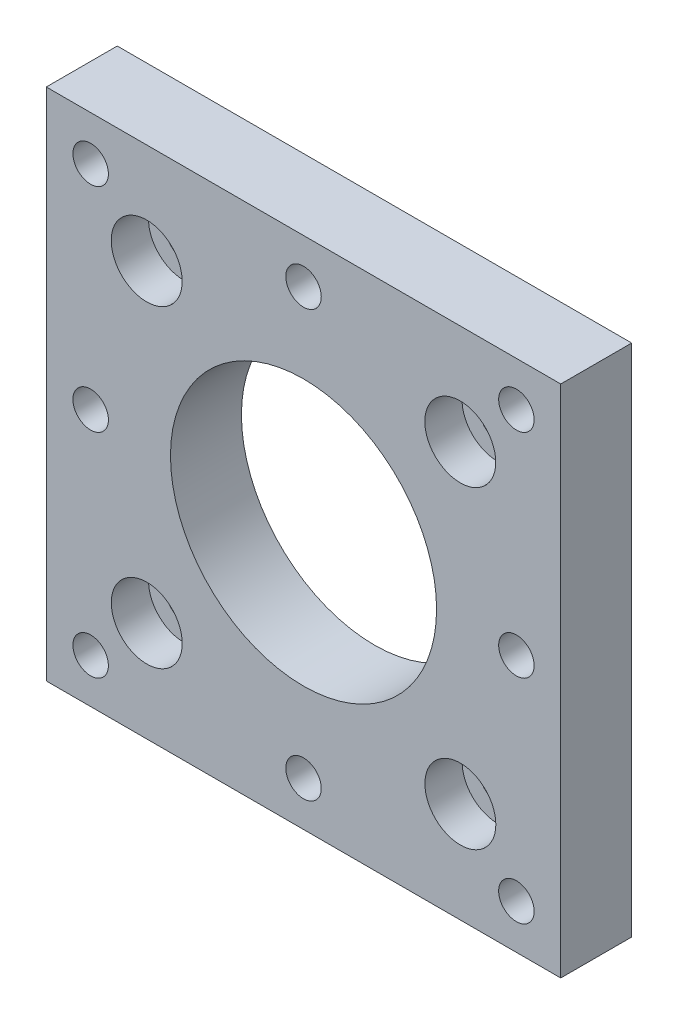
ISO-10303-21;
HEADER;
FILE_DESCRIPTION(('STEP AP214'),'2;1');
FILE_NAME('part.step','',(''),(''),'','','');
FILE_SCHEMA(('AUTOMOTIVE_DESIGN { 1 0 10303 214 1 1 1 1 }'));
ENDSEC;
DATA;
#1=APPLICATION_CONTEXT('core data for automotive mechanical design processes');
#2=APPLICATION_PROTOCOL_DEFINITION('international standard','automotive_design',2000,#1);
#3=PRODUCT_CONTEXT('',#1,'mechanical');
#4=PRODUCT('Part','Part','',(#3));
#5=PRODUCT_RELATED_PRODUCT_CATEGORY('part','',(#4));
#6=PRODUCT_DEFINITION_FORMATION('','',#4);
#7=PRODUCT_DEFINITION_CONTEXT('part definition',#1,'design');
#8=PRODUCT_DEFINITION('design','',#6,#7);
#9=PRODUCT_DEFINITION_SHAPE('','',#8);
#10=(LENGTH_UNIT() NAMED_UNIT(*) SI_UNIT(.MILLI.,.METRE.));
#11=(NAMED_UNIT(*) PLANE_ANGLE_UNIT() SI_UNIT($,.RADIAN.));
#12=(NAMED_UNIT(*) SI_UNIT($,.STERADIAN.) SOLID_ANGLE_UNIT());
#13=UNCERTAINTY_MEASURE_WITH_UNIT(LENGTH_MEASURE(1.E-05),#10,'distance_accuracy_value','');
#14=(GEOMETRIC_REPRESENTATION_CONTEXT(3) GLOBAL_UNCERTAINTY_ASSIGNED_CONTEXT((#13)) GLOBAL_UNIT_ASSIGNED_CONTEXT((#10,
#11,#12)) REPRESENTATION_CONTEXT('',''));
#15=CARTESIAN_POINT('',(0.,0.,0.));
#16=DIRECTION('',(0.,0.,1.));
#17=DIRECTION('',(1.,0.,0.));
#18=AXIS2_PLACEMENT_3D('',#15,#16,#17);
#19=CARTESIAN_POINT('',(17.673408237395,17.6819297949737,8.));
#20=DIRECTION('',(0.,0.,-1.));
#21=DIRECTION('',(-1.,0.,0.));
#22=AXIS2_PLACEMENT_3D('',#19,#20,#21);
#23=CYLINDRICAL_SURFACE('',#22,2.);
#24=CARTESIAN_POINT('',(17.673408237395,17.6819297949737,0.));
#25=DIRECTION('',(0.,0.,-1.));
#26=DIRECTION('',(-1.,0.,0.));
#27=AXIS2_PLACEMENT_3D('',#24,#25,#26);
#28=CIRCLE('',#27,2.);
#29=CARTESIAN_POINT('',(15.673408237395,17.6819297949737,0.));
#30=VERTEX_POINT('',#29);
#31=EDGE_CURVE('E140',#30,#30,#28,.T.);
#32=ORIENTED_EDGE('',*,*,#31,.T.);
#33=EDGE_LOOP('',(#32));
#34=FACE_BOUND('',#33,.T.);
#35=CARTESIAN_POINT('',(17.673408237395,17.6819297949737,3.8));
#36=DIRECTION('',(0.,0.,1.));
#37=DIRECTION('',(1.,0.,0.));
#38=AXIS2_PLACEMENT_3D('',#35,#36,#37);
#39=CIRCLE('',#38,2.);
#40=CARTESIAN_POINT('',(19.673408237395,17.6819297949737,3.8));
#41=VERTEX_POINT('',#40);
#42=EDGE_CURVE('E43',#41,#41,#39,.F.);
#43=ORIENTED_EDGE('',*,*,#42,.F.);
#44=EDGE_LOOP('',(#43));
#45=FACE_BOUND('',#44,.T.);
#46=ADVANCED_FACE('F39',(#34,#45),#23,.F.);
#47=CARTESIAN_POINT('',(-17.6819297949737,17.673408237395,8.));
#48=DIRECTION('',(0.,0.,-1.));
#49=DIRECTION('',(-1.,0.,0.));
#50=AXIS2_PLACEMENT_3D('',#47,#48,#49);
#51=CYLINDRICAL_SURFACE('',#50,2.);
#52=CARTESIAN_POINT('',(-17.6819297949737,17.673408237395,0.));
#53=DIRECTION('',(0.,0.,-1.));
#54=DIRECTION('',(-1.,0.,0.));
#55=AXIS2_PLACEMENT_3D('',#52,#53,#54);
#56=CIRCLE('',#55,2.);
#57=CARTESIAN_POINT('',(-19.6819297949737,17.673408237395,0.));
#58=VERTEX_POINT('',#57);
#59=EDGE_CURVE('E136',#58,#58,#56,.T.);
#60=ORIENTED_EDGE('',*,*,#59,.T.);
#61=EDGE_LOOP('',(#60));
#62=FACE_BOUND('',#61,.T.);
#63=CARTESIAN_POINT('',(-17.6819297949737,17.673408237395,3.8));
#64=DIRECTION('',(0.,0.,1.));
#65=DIRECTION('',(1.,0.,0.));
#66=AXIS2_PLACEMENT_3D('',#63,#64,#65);
#67=CIRCLE('',#66,2.);
#68=CARTESIAN_POINT('',(-15.6819297949737,17.673408237395,3.8));
#69=VERTEX_POINT('',#68);
#70=EDGE_CURVE('E122',#69,#69,#67,.F.);
#71=ORIENTED_EDGE('',*,*,#70,.F.);
#72=EDGE_LOOP('',(#71));
#73=FACE_BOUND('',#72,.T.);
#74=ADVANCED_FACE('F216',(#62,#73),#51,.F.);
#75=CARTESIAN_POINT('',(-17.6734082373949,-17.6819297949738,8.));
#76=DIRECTION('',(0.,0.,-1.));
#77=DIRECTION('',(-1.,0.,0.));
#78=AXIS2_PLACEMENT_3D('',#75,#76,#77);
#79=CYLINDRICAL_SURFACE('',#78,2.);
#80=CARTESIAN_POINT('',(-17.6734082373949,-17.6819297949738,0.));
#81=DIRECTION('',(0.,0.,-1.));
#82=DIRECTION('',(-1.,0.,0.));
#83=AXIS2_PLACEMENT_3D('',#80,#81,#82);
#84=CIRCLE('',#83,2.);
#85=CARTESIAN_POINT('',(-19.6734082373949,-17.6819297949738,0.));
#86=VERTEX_POINT('',#85);
#87=EDGE_CURVE('E131',#86,#86,#84,.T.);
#88=ORIENTED_EDGE('',*,*,#87,.T.);
#89=EDGE_LOOP('',(#88));
#90=FACE_BOUND('',#89,.T.);
#91=CARTESIAN_POINT('',(-17.6734082373949,-17.6819297949738,3.8));
#92=DIRECTION('',(0.,0.,1.));
#93=DIRECTION('',(1.,0.,0.));
#94=AXIS2_PLACEMENT_3D('',#91,#92,#93);
#95=CIRCLE('',#94,2.);
#96=CARTESIAN_POINT('',(-15.6734082373949,-17.6819297949738,3.8));
#97=VERTEX_POINT('',#96);
#98=EDGE_CURVE('E119',#97,#97,#95,.F.);
#99=ORIENTED_EDGE('',*,*,#98,.F.);
#100=EDGE_LOOP('',(#99));
#101=FACE_BOUND('',#100,.T.);
#102=ADVANCED_FACE('F222',(#90,#101),#79,.F.);
#103=CARTESIAN_POINT('',(17.6819297949739,-17.6734082373948,8.));
#104=DIRECTION('',(0.,0.,-1.));
#105=DIRECTION('',(-1.,0.,0.));
#106=AXIS2_PLACEMENT_3D('',#103,#104,#105);
#107=CYLINDRICAL_SURFACE('',#106,2.);
#108=CARTESIAN_POINT('',(17.6819297949739,-17.6734082373948,0.));
#109=DIRECTION('',(0.,0.,-1.));
#110=DIRECTION('',(-1.,0.,0.));
#111=AXIS2_PLACEMENT_3D('',#108,#109,#110);
#112=CIRCLE('',#111,2.);
#113=CARTESIAN_POINT('',(15.6819297949739,-17.6734082373948,0.));
#114=VERTEX_POINT('',#113);
#115=EDGE_CURVE('E127',#114,#114,#112,.T.);
#116=ORIENTED_EDGE('',*,*,#115,.T.);
#117=EDGE_LOOP('',(#116));
#118=FACE_BOUND('',#117,.T.);
#119=CARTESIAN_POINT('',(17.6819297949739,-17.6734082373948,3.8));
#120=DIRECTION('',(0.,0.,1.));
#121=DIRECTION('',(1.,0.,0.));
#122=AXIS2_PLACEMENT_3D('',#119,#120,#121);
#123=CIRCLE('',#122,2.);
#124=CARTESIAN_POINT('',(19.6819297949739,-17.6734082373948,3.8));
#125=VERTEX_POINT('',#124);
#126=EDGE_CURVE('E116',#125,#125,#123,.F.);
#127=ORIENTED_EDGE('',*,*,#126,.F.);
#128=EDGE_LOOP('',(#127));
#129=FACE_BOUND('',#128,.T.);
#130=ADVANCED_FACE('F228',(#118,#129),#107,.F.);
#131=CARTESIAN_POINT('',(0.,0.,8.));
#132=DIRECTION('',(0.,0.,-1.));
#133=DIRECTION('',(-1.,0.,0.));
#134=AXIS2_PLACEMENT_3D('',#131,#132,#133);
#135=PLANE('',#134);
#136=CARTESIAN_POINT('',(-17.6734082373951,-17.6819297949736,8.));
#137=DIRECTION('',(0.,0.,1.));
#138=DIRECTION('',(1.,0.,0.));
#139=AXIS2_PLACEMENT_3D('',#136,#137,#138);
#140=CIRCLE('',#139,4.);
#141=CARTESIAN_POINT('',(-13.6734082373951,-17.6819297949736,8.));
#142=VERTEX_POINT('',#141);
#143=EDGE_CURVE('E513',#142,#142,#140,.T.);
#144=ORIENTED_EDGE('',*,*,#143,.F.);
#145=EDGE_LOOP('',(#144));
#146=FACE_BOUND('',#145,.T.);
#147=CARTESIAN_POINT('',(17.6819297949736,-17.6734082373951,8.));
#148=DIRECTION('',(0.,0.,1.));
#149=DIRECTION('',(1.,0.,0.));
#150=AXIS2_PLACEMENT_3D('',#147,#148,#149);
#151=CIRCLE('',#150,4.);
#152=CARTESIAN_POINT('',(21.6819297949736,-17.6734082373951,8.));
#153=VERTEX_POINT('',#152);
#154=EDGE_CURVE('E505',#153,#153,#151,.T.);
#155=ORIENTED_EDGE('',*,*,#154,.F.);
#156=EDGE_LOOP('',(#155));
#157=FACE_BOUND('',#156,.T.);
#158=CARTESIAN_POINT('',(17.673408237395,17.6819297949737,8.));
#159=DIRECTION('',(0.,0.,1.));
#160=DIRECTION('',(1.,0.,0.));
#161=AXIS2_PLACEMENT_3D('',#158,#159,#160);
#162=CIRCLE('',#161,4.);
#163=CARTESIAN_POINT('',(21.673408237395,17.6819297949737,8.));
#164=VERTEX_POINT('',#163);
#165=EDGE_CURVE('E499',#164,#164,#162,.T.);
#166=ORIENTED_EDGE('',*,*,#165,.F.);
#167=EDGE_LOOP('',(#166));
#168=FACE_BOUND('',#167,.T.);
#169=CARTESIAN_POINT('',(-17.6819297949737,17.673408237395,8.));
#170=DIRECTION('',(0.,0.,1.));
#171=DIRECTION('',(1.,0.,0.));
#172=AXIS2_PLACEMENT_3D('',#169,#170,#171);
#173=CIRCLE('',#172,4.);
#174=CARTESIAN_POINT('',(-13.6819297949737,17.673408237395,8.));
#175=VERTEX_POINT('',#174);
#176=EDGE_CURVE('E501',#175,#175,#173,.T.);
#177=ORIENTED_EDGE('',*,*,#176,.F.);
#178=EDGE_LOOP('',(#177));
#179=FACE_BOUND('',#178,.T.);
#180=DIRECTION('',(0.,1.,0.));
#181=VECTOR('',#180,1.);
#182=CARTESIAN_POINT('',(29.,-29.,8.));
#183=LINE('',#182,#181);
#184=CARTESIAN_POINT('',(29.,-29.,8.));
#185=VERTEX_POINT('',#184);
#186=CARTESIAN_POINT('',(29.,29.,8.));
#187=VERTEX_POINT('',#186);
#188=EDGE_CURVE('E94',#185,#187,#183,.T.);
#189=ORIENTED_EDGE('',*,*,#188,.T.);
#190=DIRECTION('',(-1.,0.,0.));
#191=VECTOR('',#190,1.);
#192=CARTESIAN_POINT('',(-29.,29.,8.));
#193=LINE('',#192,#191);
#194=CARTESIAN_POINT('',(-29.,29.,8.));
#195=VERTEX_POINT('',#194);
#196=EDGE_CURVE('E88',#187,#195,#193,.T.);
#197=ORIENTED_EDGE('',*,*,#196,.T.);
#198=DIRECTION('',(0.,-1.,0.));
#199=VECTOR('',#198,1.);
#200=CARTESIAN_POINT('',(-29.,-29.,8.));
#201=LINE('',#200,#199);
#202=CARTESIAN_POINT('',(-29.,-29.,8.));
#203=VERTEX_POINT('',#202);
#204=EDGE_CURVE('E92',#195,#203,#201,.T.);
#205=ORIENTED_EDGE('',*,*,#204,.T.);
#206=DIRECTION('',(1.,0.,0.));
#207=VECTOR('',#206,1.);
#208=CARTESIAN_POINT('',(-29.,-29.,8.));
#209=LINE('',#208,#207);
#210=EDGE_CURVE('E58',#203,#185,#209,.T.);
#211=ORIENTED_EDGE('',*,*,#210,.T.);
#212=EDGE_LOOP('',(#189,#197,#205,#211));
#213=FACE_BOUND('',#212,.T.);
#214=CARTESIAN_POINT('',(0.,0.,8.));
#215=DIRECTION('',(0.,0.,1.));
#216=DIRECTION('',(1.,0.,0.));
#217=AXIS2_PLACEMENT_3D('',#214,#215,#216);
#218=CIRCLE('',#217,15.);
#219=CARTESIAN_POINT('',(15.,0.,8.));
#220=VERTEX_POINT('',#219);
#221=EDGE_CURVE('E110',#220,#220,#218,.T.);
#222=ORIENTED_EDGE('',*,*,#221,.F.);
#223=EDGE_LOOP('',(#222));
#224=FACE_BOUND('',#223,.T.);
#225=CARTESIAN_POINT('',(0.,24.,8.));
#226=DIRECTION('',(0.,0.,1.));
#227=DIRECTION('',(1.,0.,0.));
#228=AXIS2_PLACEMENT_3D('',#225,#226,#227);
#229=CIRCLE('',#228,2.);
#230=CARTESIAN_POINT('',(2.,24.,8.));
#231=VERTEX_POINT('',#230);
#232=EDGE_CURVE('E186',#231,#231,#229,.T.);
#233=ORIENTED_EDGE('',*,*,#232,.F.);
#234=EDGE_LOOP('',(#233));
#235=FACE_BOUND('',#234,.T.);
#236=CARTESIAN_POINT('',(-24.,24.,8.));
#237=DIRECTION('',(0.,0.,1.));
#238=DIRECTION('',(1.,0.,0.));
#239=AXIS2_PLACEMENT_3D('',#236,#237,#238);
#240=CIRCLE('',#239,2.);
#241=CARTESIAN_POINT('',(-22.,24.,8.));
#242=VERTEX_POINT('',#241);
#243=EDGE_CURVE('E180',#242,#242,#240,.T.);
#244=ORIENTED_EDGE('',*,*,#243,.F.);
#245=EDGE_LOOP('',(#244));
#246=FACE_BOUND('',#245,.T.);
#247=CARTESIAN_POINT('',(24.,0.,8.));
#248=DIRECTION('',(0.,0.,1.));
#249=DIRECTION('',(1.,0.,0.));
#250=AXIS2_PLACEMENT_3D('',#247,#248,#249);
#251=CIRCLE('',#250,2.);
#252=CARTESIAN_POINT('',(26.,0.,8.));
#253=VERTEX_POINT('',#252);
#254=EDGE_CURVE('E174',#253,#253,#251,.T.);
#255=ORIENTED_EDGE('',*,*,#254,.F.);
#256=EDGE_LOOP('',(#255));
#257=FACE_BOUND('',#256,.T.);
#258=CARTESIAN_POINT('',(-1.66872558273754E-13,-24.,8.));
#259=DIRECTION('',(0.,0.,1.));
#260=DIRECTION('',(1.,0.,0.));
#261=AXIS2_PLACEMENT_3D('',#258,#259,#260);
#262=CIRCLE('',#261,2.);
#263=CARTESIAN_POINT('',(1.99999999999983,-24.,8.));
#264=VERTEX_POINT('',#263);
#265=EDGE_CURVE('E168',#264,#264,#262,.T.);
#266=ORIENTED_EDGE('',*,*,#265,.F.);
#267=EDGE_LOOP('',(#266));
#268=FACE_BOUND('',#267,.T.);
#269=CARTESIAN_POINT('',(-24.,2.50668110405989E-13,8.));
#270=DIRECTION('',(0.,0.,1.));
#271=DIRECTION('',(1.,0.,0.));
#272=AXIS2_PLACEMENT_3D('',#269,#270,#271);
#273=CIRCLE('',#272,2.);
#274=CARTESIAN_POINT('',(-22.,2.50668110405989E-13,8.));
#275=VERTEX_POINT('',#274);
#276=EDGE_CURVE('E162',#275,#275,#273,.T.);
#277=ORIENTED_EDGE('',*,*,#276,.F.);
#278=EDGE_LOOP('',(#277));
#279=FACE_BOUND('',#278,.T.);
#280=CARTESIAN_POINT('',(24.,-24.,8.));
#281=DIRECTION('',(0.,0.,1.));
#282=DIRECTION('',(-1.,0.,0.));
#283=AXIS2_PLACEMENT_3D('',#280,#281,#282);
#284=CIRCLE('',#283,2.);
#285=CARTESIAN_POINT('',(22.,-24.,8.));
#286=VERTEX_POINT('',#285);
#287=EDGE_CURVE('E156',#286,#286,#284,.T.);
#288=ORIENTED_EDGE('',*,*,#287,.F.);
#289=EDGE_LOOP('',(#288));
#290=FACE_BOUND('',#289,.T.);
#291=CARTESIAN_POINT('',(24.,24.,8.));
#292=DIRECTION('',(0.,0.,1.));
#293=DIRECTION('',(1.,0.,0.));
#294=AXIS2_PLACEMENT_3D('',#291,#292,#293);
#295=CIRCLE('',#294,2.);
#296=CARTESIAN_POINT('',(26.,24.,8.));
#297=VERTEX_POINT('',#296);
#298=EDGE_CURVE('E150',#297,#297,#295,.T.);
#299=ORIENTED_EDGE('',*,*,#298,.F.);
#300=EDGE_LOOP('',(#299));
#301=FACE_BOUND('',#300,.T.);
#302=CARTESIAN_POINT('',(-24.,-24.,8.));
#303=DIRECTION('',(0.,0.,1.));
#304=DIRECTION('',(-1.,0.,0.));
#305=AXIS2_PLACEMENT_3D('',#302,#303,#304);
#306=CIRCLE('',#305,2.);
#307=CARTESIAN_POINT('',(-26.,-24.,8.));
#308=VERTEX_POINT('',#307);
#309=EDGE_CURVE('E144',#308,#308,#306,.T.);
#310=ORIENTED_EDGE('',*,*,#309,.F.);
#311=EDGE_LOOP('',(#310));
#312=FACE_BOUND('',#311,.T.);
#313=ADVANCED_FACE('F89',(#146,#157,#168,#179,#213,#224,#235,#246,#257,#268,#279,#290,#301,
#312),#135,.F.);
#314=CARTESIAN_POINT('',(0.,0.,0.));
#315=DIRECTION('',(0.,0.,-1.));
#316=DIRECTION('',(-1.,0.,0.));
#317=AXIS2_PLACEMENT_3D('',#314,#315,#316);
#318=PLANE('',#317);
#319=ORIENTED_EDGE('',*,*,#115,.F.);
#320=EDGE_LOOP('',(#319));
#321=FACE_BOUND('',#320,.T.);
#322=ORIENTED_EDGE('',*,*,#87,.F.);
#323=EDGE_LOOP('',(#322));
#324=FACE_BOUND('',#323,.T.);
#325=ORIENTED_EDGE('',*,*,#59,.F.);
#326=EDGE_LOOP('',(#325));
#327=FACE_BOUND('',#326,.T.);
#328=ORIENTED_EDGE('',*,*,#31,.F.);
#329=EDGE_LOOP('',(#328));
#330=FACE_BOUND('',#329,.T.);
#331=CARTESIAN_POINT('',(24.,24.,0.));
#332=DIRECTION('',(0.,0.,1.));
#333=DIRECTION('',(1.,0.,0.));
#334=AXIS2_PLACEMENT_3D('',#331,#332,#333);
#335=CIRCLE('',#334,2.);
#336=CARTESIAN_POINT('',(26.,24.,0.));
#337=VERTEX_POINT('',#336);
#338=EDGE_CURVE('E147',#337,#337,#335,.T.);
#339=ORIENTED_EDGE('',*,*,#338,.T.);
#340=EDGE_LOOP('',(#339));
#341=FACE_BOUND('',#340,.T.);
#342=CARTESIAN_POINT('',(-24.,2.50668110405989E-13,0.));
#343=DIRECTION('',(0.,0.,1.));
#344=DIRECTION('',(1.,0.,0.));
#345=AXIS2_PLACEMENT_3D('',#342,#343,#344);
#346=CIRCLE('',#345,2.);
#347=CARTESIAN_POINT('',(-22.,2.50668110405989E-13,0.));
#348=VERTEX_POINT('',#347);
#349=EDGE_CURVE('E159',#348,#348,#346,.T.);
#350=ORIENTED_EDGE('',*,*,#349,.T.);
#351=EDGE_LOOP('',(#350));
#352=FACE_BOUND('',#351,.T.);
#353=CARTESIAN_POINT('',(24.,0.,0.));
#354=DIRECTION('',(0.,0.,1.));
#355=DIRECTION('',(1.,0.,0.));
#356=AXIS2_PLACEMENT_3D('',#353,#354,#355);
#357=CIRCLE('',#356,2.);
#358=CARTESIAN_POINT('',(26.,0.,0.));
#359=VERTEX_POINT('',#358);
#360=EDGE_CURVE('E171',#359,#359,#357,.T.);
#361=ORIENTED_EDGE('',*,*,#360,.T.);
#362=EDGE_LOOP('',(#361));
#363=FACE_BOUND('',#362,.T.);
#364=CARTESIAN_POINT('',(0.,24.,0.));
#365=DIRECTION('',(0.,0.,1.));
#366=DIRECTION('',(1.,0.,0.));
#367=AXIS2_PLACEMENT_3D('',#364,#365,#366);
#368=CIRCLE('',#367,2.);
#369=CARTESIAN_POINT('',(2.,24.,0.));
#370=VERTEX_POINT('',#369);
#371=EDGE_CURVE('E183',#370,#370,#368,.T.);
#372=ORIENTED_EDGE('',*,*,#371,.T.);
#373=EDGE_LOOP('',(#372));
#374=FACE_BOUND('',#373,.T.);
#375=DIRECTION('',(0.,1.,0.));
#376=VECTOR('',#375,1.);
#377=CARTESIAN_POINT('',(29.,-29.,0.));
#378=LINE('',#377,#376);
#379=CARTESIAN_POINT('',(29.,-29.,0.));
#380=VERTEX_POINT('',#379);
#381=CARTESIAN_POINT('',(29.,29.,0.));
#382=VERTEX_POINT('',#381);
#383=EDGE_CURVE('E107',#380,#382,#378,.T.);
#384=ORIENTED_EDGE('',*,*,#383,.F.);
#385=DIRECTION('',(1.,0.,0.));
#386=VECTOR('',#385,1.);
#387=CARTESIAN_POINT('',(-29.,-29.,0.));
#388=LINE('',#387,#386);
#389=CARTESIAN_POINT('',(-29.,-29.,0.));
#390=VERTEX_POINT('',#389);
#391=EDGE_CURVE('E81',#390,#380,#388,.T.);
#392=ORIENTED_EDGE('',*,*,#391,.F.);
#393=DIRECTION('',(0.,-1.,0.));
#394=VECTOR('',#393,1.);
#395=CARTESIAN_POINT('',(-29.,-29.,0.));
#396=LINE('',#395,#394);
#397=CARTESIAN_POINT('',(-29.,29.,0.));
#398=VERTEX_POINT('',#397);
#399=EDGE_CURVE('E75',#398,#390,#396,.T.);
#400=ORIENTED_EDGE('',*,*,#399,.F.);
#401=DIRECTION('',(-1.,0.,0.));
#402=VECTOR('',#401,1.);
#403=CARTESIAN_POINT('',(-29.,29.,0.));
#404=LINE('',#403,#402);
#405=EDGE_CURVE('E98',#382,#398,#404,.T.);
#406=ORIENTED_EDGE('',*,*,#405,.F.);
#407=EDGE_LOOP('',(#384,#392,#400,#406));
#408=FACE_BOUND('',#407,.T.);
#409=CARTESIAN_POINT('',(0.,0.,0.));
#410=DIRECTION('',(0.,0.,1.));
#411=DIRECTION('',(1.,0.,0.));
#412=AXIS2_PLACEMENT_3D('',#409,#410,#411);
#413=CIRCLE('',#412,15.);
#414=CARTESIAN_POINT('',(15.,0.,0.));
#415=VERTEX_POINT('',#414);
#416=EDGE_CURVE('E189',#415,#415,#413,.T.);
#417=ORIENTED_EDGE('',*,*,#416,.T.);
#418=EDGE_LOOP('',(#417));
#419=FACE_BOUND('',#418,.T.);
#420=CARTESIAN_POINT('',(-24.,24.,0.));
#421=DIRECTION('',(0.,0.,1.));
#422=DIRECTION('',(1.,0.,0.));
#423=AXIS2_PLACEMENT_3D('',#420,#421,#422);
#424=CIRCLE('',#423,2.);
#425=CARTESIAN_POINT('',(-22.,24.,0.));
#426=VERTEX_POINT('',#425);
#427=EDGE_CURVE('E177',#426,#426,#424,.T.);
#428=ORIENTED_EDGE('',*,*,#427,.T.);
#429=EDGE_LOOP('',(#428));
#430=FACE_BOUND('',#429,.T.);
#431=CARTESIAN_POINT('',(-1.66872558273754E-13,-24.,0.));
#432=DIRECTION('',(0.,0.,1.));
#433=DIRECTION('',(1.,0.,0.));
#434=AXIS2_PLACEMENT_3D('',#431,#432,#433);
#435=CIRCLE('',#434,2.);
#436=CARTESIAN_POINT('',(1.99999999999983,-24.,0.));
#437=VERTEX_POINT('',#436);
#438=EDGE_CURVE('E165',#437,#437,#435,.T.);
#439=ORIENTED_EDGE('',*,*,#438,.T.);
#440=EDGE_LOOP('',(#439));
#441=FACE_BOUND('',#440,.T.);
#442=CARTESIAN_POINT('',(24.,-24.,0.));
#443=DIRECTION('',(0.,0.,1.));
#444=DIRECTION('',(-1.,0.,0.));
#445=AXIS2_PLACEMENT_3D('',#442,#443,#444);
#446=CIRCLE('',#445,2.);
#447=CARTESIAN_POINT('',(22.,-24.,0.));
#448=VERTEX_POINT('',#447);
#449=EDGE_CURVE('E153',#448,#448,#446,.T.);
#450=ORIENTED_EDGE('',*,*,#449,.T.);
#451=EDGE_LOOP('',(#450));
#452=FACE_BOUND('',#451,.T.);
#453=CARTESIAN_POINT('',(-24.,-24.,0.));
#454=DIRECTION('',(0.,0.,1.));
#455=DIRECTION('',(-1.,0.,0.));
#456=AXIS2_PLACEMENT_3D('',#453,#454,#455);
#457=CIRCLE('',#456,2.);
#458=CARTESIAN_POINT('',(-26.,-24.,0.));
#459=VERTEX_POINT('',#458);
#460=EDGE_CURVE('E143',#459,#459,#457,.T.);
#461=ORIENTED_EDGE('',*,*,#460,.T.);
#462=EDGE_LOOP('',(#461));
#463=FACE_BOUND('',#462,.T.);
#464=ADVANCED_FACE('F197',(#321,#324,#327,#330,#341,#352,#363,#374,#408,#419,#430,#441,#452,
#463),#318,.T.);
#465=CARTESIAN_POINT('',(29.,-29.,8.));
#466=DIRECTION('',(-1.,0.,0.));
#467=DIRECTION('',(0.,-1.,0.));
#468=AXIS2_PLACEMENT_3D('',#465,#466,#467);
#469=PLANE('',#468);
#470=ORIENTED_EDGE('',*,*,#383,.T.);
#471=DIRECTION('',(0.,0.,-1.));
#472=VECTOR('',#471,1.);
#473=CARTESIAN_POINT('',(29.,29.,8.));
#474=LINE('',#473,#472);
#475=EDGE_CURVE('E11',#187,#382,#474,.T.);
#476=ORIENTED_EDGE('',*,*,#475,.F.);
#477=ORIENTED_EDGE('',*,*,#188,.F.);
#478=DIRECTION('',(0.,0.,-1.));
#479=VECTOR('',#478,1.);
#480=CARTESIAN_POINT('',(29.,-29.,8.));
#481=LINE('',#480,#479);
#482=EDGE_CURVE('E103',#185,#380,#481,.T.);
#483=ORIENTED_EDGE('',*,*,#482,.T.);
#484=EDGE_LOOP('',(#470,#476,#477,#483));
#485=FACE_BOUND('',#484,.T.);
#486=ADVANCED_FACE('F41',(#485),#469,.F.);
#487=CARTESIAN_POINT('',(-29.,29.,8.));
#488=DIRECTION('',(0.,-1.,0.));
#489=DIRECTION('',(1.,0.,0.));
#490=AXIS2_PLACEMENT_3D('',#487,#488,#489);
#491=PLANE('',#490);
#492=ORIENTED_EDGE('',*,*,#405,.T.);
#493=DIRECTION('',(0.,0.,-1.));
#494=VECTOR('',#493,1.);
#495=CARTESIAN_POINT('',(-29.,29.,8.));
#496=LINE('',#495,#494);
#497=EDGE_CURVE('E49',#195,#398,#496,.T.);
#498=ORIENTED_EDGE('',*,*,#497,.F.);
#499=ORIENTED_EDGE('',*,*,#196,.F.);
#500=ORIENTED_EDGE('',*,*,#475,.T.);
#501=EDGE_LOOP('',(#492,#498,#499,#500));
#502=FACE_BOUND('',#501,.T.);
#503=ADVANCED_FACE('F97',(#502),#491,.F.);
#504=CARTESIAN_POINT('',(-29.,-29.,8.));
#505=DIRECTION('',(1.,0.,0.));
#506=DIRECTION('',(0.,1.,0.));
#507=AXIS2_PLACEMENT_3D('',#504,#505,#506);
#508=PLANE('',#507);
#509=ORIENTED_EDGE('',*,*,#399,.T.);
#510=DIRECTION('',(0.,0.,-1.));
#511=VECTOR('',#510,1.);
#512=CARTESIAN_POINT('',(-29.,-29.,8.));
#513=LINE('',#512,#511);
#514=EDGE_CURVE('E99',#203,#390,#513,.T.);
#515=ORIENTED_EDGE('',*,*,#514,.F.);
#516=ORIENTED_EDGE('',*,*,#204,.F.);
#517=ORIENTED_EDGE('',*,*,#497,.T.);
#518=EDGE_LOOP('',(#509,#515,#516,#517));
#519=FACE_BOUND('',#518,.T.);
#520=ADVANCED_FACE('F101',(#519),#508,.F.);
#521=CARTESIAN_POINT('',(-29.,-29.,8.));
#522=DIRECTION('',(0.,1.,0.));
#523=DIRECTION('',(0.,0.,1.));
#524=AXIS2_PLACEMENT_3D('',#521,#522,#523);
#525=PLANE('',#524);
#526=ORIENTED_EDGE('',*,*,#391,.T.);
#527=ORIENTED_EDGE('',*,*,#482,.F.);
#528=ORIENTED_EDGE('',*,*,#210,.F.);
#529=ORIENTED_EDGE('',*,*,#514,.T.);
#530=EDGE_LOOP('',(#526,#527,#528,#529));
#531=FACE_BOUND('',#530,.T.);
#532=ADVANCED_FACE('F203',(#531),#525,.F.);
#533=CARTESIAN_POINT('',(0.,0.,8.));
#534=DIRECTION('',(0.,0.,-1.));
#535=DIRECTION('',(-1.,0.,0.));
#536=AXIS2_PLACEMENT_3D('',#533,#534,#535);
#537=CYLINDRICAL_SURFACE('',#536,15.);
#538=ORIENTED_EDGE('',*,*,#221,.T.);
#539=EDGE_LOOP('',(#538));
#540=FACE_BOUND('',#539,.T.);
#541=ORIENTED_EDGE('',*,*,#416,.F.);
#542=EDGE_LOOP('',(#541));
#543=FACE_BOUND('',#542,.T.);
#544=ADVANCED_FACE('F200',(#540,#543),#537,.F.);
#545=CARTESIAN_POINT('',(0.,24.,8.));
#546=DIRECTION('',(0.,0.,-1.));
#547=DIRECTION('',(-1.,0.,0.));
#548=AXIS2_PLACEMENT_3D('',#545,#546,#547);
#549=CYLINDRICAL_SURFACE('',#548,2.);
#550=ORIENTED_EDGE('',*,*,#232,.T.);
#551=EDGE_LOOP('',(#550));
#552=FACE_BOUND('',#551,.T.);
#553=ORIENTED_EDGE('',*,*,#371,.F.);
#554=EDGE_LOOP('',(#553));
#555=FACE_BOUND('',#554,.T.);
#556=ADVANCED_FACE('F202',(#552,#555),#549,.F.);
#557=CARTESIAN_POINT('',(-24.,24.,8.));
#558=DIRECTION('',(0.,0.,-1.));
#559=DIRECTION('',(-1.,0.,0.));
#560=AXIS2_PLACEMENT_3D('',#557,#558,#559);
#561=CYLINDRICAL_SURFACE('',#560,2.);
#562=ORIENTED_EDGE('',*,*,#243,.T.);
#563=EDGE_LOOP('',(#562));
#564=FACE_BOUND('',#563,.T.);
#565=ORIENTED_EDGE('',*,*,#427,.F.);
#566=EDGE_LOOP('',(#565));
#567=FACE_BOUND('',#566,.T.);
#568=ADVANCED_FACE('F210',(#564,#567),#561,.F.);
#569=CARTESIAN_POINT('',(24.,0.,8.));
#570=DIRECTION('',(0.,0.,-1.));
#571=DIRECTION('',(-1.,0.,0.));
#572=AXIS2_PLACEMENT_3D('',#569,#570,#571);
#573=CYLINDRICAL_SURFACE('',#572,2.);
#574=ORIENTED_EDGE('',*,*,#254,.T.);
#575=EDGE_LOOP('',(#574));
#576=FACE_BOUND('',#575,.T.);
#577=ORIENTED_EDGE('',*,*,#360,.F.);
#578=EDGE_LOOP('',(#577));
#579=FACE_BOUND('',#578,.T.);
#580=ADVANCED_FACE('F250',(#576,#579),#573,.F.);
#581=CARTESIAN_POINT('',(-1.66872558273754E-13,-24.,8.));
#582=DIRECTION('',(0.,0.,-1.));
#583=DIRECTION('',(-1.,0.,0.));
#584=AXIS2_PLACEMENT_3D('',#581,#582,#583);
#585=CYLINDRICAL_SURFACE('',#584,2.);
#586=ORIENTED_EDGE('',*,*,#265,.T.);
#587=EDGE_LOOP('',(#586));
#588=FACE_BOUND('',#587,.T.);
#589=ORIENTED_EDGE('',*,*,#438,.F.);
#590=EDGE_LOOP('',(#589));
#591=FACE_BOUND('',#590,.T.);
#592=ADVANCED_FACE('F246',(#588,#591),#585,.F.);
#593=CARTESIAN_POINT('',(-24.,2.50668110405989E-13,8.));
#594=DIRECTION('',(0.,0.,-1.));
#595=DIRECTION('',(-1.,0.,0.));
#596=AXIS2_PLACEMENT_3D('',#593,#594,#595);
#597=CYLINDRICAL_SURFACE('',#596,2.);
#598=ORIENTED_EDGE('',*,*,#276,.T.);
#599=EDGE_LOOP('',(#598));
#600=FACE_BOUND('',#599,.T.);
#601=ORIENTED_EDGE('',*,*,#349,.F.);
#602=EDGE_LOOP('',(#601));
#603=FACE_BOUND('',#602,.T.);
#604=ADVANCED_FACE('F242',(#600,#603),#597,.F.);
#605=CARTESIAN_POINT('',(24.,-24.,8.));
#606=DIRECTION('',(0.,0.,-1.));
#607=DIRECTION('',(-1.,0.,0.));
#608=AXIS2_PLACEMENT_3D('',#605,#606,#607);
#609=CYLINDRICAL_SURFACE('',#608,2.);
#610=ORIENTED_EDGE('',*,*,#287,.T.);
#611=EDGE_LOOP('',(#610));
#612=FACE_BOUND('',#611,.T.);
#613=ORIENTED_EDGE('',*,*,#449,.F.);
#614=EDGE_LOOP('',(#613));
#615=FACE_BOUND('',#614,.T.);
#616=ADVANCED_FACE('F238',(#612,#615),#609,.F.);
#617=CARTESIAN_POINT('',(24.,24.,8.));
#618=DIRECTION('',(0.,0.,-1.));
#619=DIRECTION('',(-1.,0.,0.));
#620=AXIS2_PLACEMENT_3D('',#617,#618,#619);
#621=CYLINDRICAL_SURFACE('',#620,2.);
#622=ORIENTED_EDGE('',*,*,#298,.T.);
#623=EDGE_LOOP('',(#622));
#624=FACE_BOUND('',#623,.T.);
#625=ORIENTED_EDGE('',*,*,#338,.F.);
#626=EDGE_LOOP('',(#625));
#627=FACE_BOUND('',#626,.T.);
#628=ADVANCED_FACE('F234',(#624,#627),#621,.F.);
#629=CARTESIAN_POINT('',(-24.,-24.,8.));
#630=DIRECTION('',(0.,0.,-1.));
#631=DIRECTION('',(-1.,0.,0.));
#632=AXIS2_PLACEMENT_3D('',#629,#630,#631);
#633=CYLINDRICAL_SURFACE('',#632,2.);
#634=ORIENTED_EDGE('',*,*,#309,.T.);
#635=EDGE_LOOP('',(#634));
#636=FACE_BOUND('',#635,.T.);
#637=ORIENTED_EDGE('',*,*,#460,.F.);
#638=EDGE_LOOP('',(#637));
#639=FACE_BOUND('',#638,.T.);
#640=ADVANCED_FACE('F230',(#636,#639),#633,.F.);
#641=CARTESIAN_POINT('',(17.6819297949736,-17.6734082373951,3.8));
#642=DIRECTION('',(0.,0.,1.));
#643=DIRECTION('',(1.,0.,0.));
#644=AXIS2_PLACEMENT_3D('',#641,#642,#643);
#645=PLANE('',#644);
#646=CARTESIAN_POINT('',(17.6819297949736,-17.6734082373951,3.8));
#647=DIRECTION('',(0.,0.,1.));
#648=DIRECTION('',(1.,0.,0.));
#649=AXIS2_PLACEMENT_3D('',#646,#647,#648);
#650=CIRCLE('',#649,4.);
#651=CARTESIAN_POINT('',(21.6819297949736,-17.6734082373951,3.8));
#652=VERTEX_POINT('',#651);
#653=EDGE_CURVE('E510',#652,#652,#650,.T.);
#654=ORIENTED_EDGE('',*,*,#653,.T.);
#655=EDGE_LOOP('',(#654));
#656=FACE_BOUND('',#655,.T.);
#657=ORIENTED_EDGE('',*,*,#126,.T.);
#658=EDGE_LOOP('',(#657));
#659=FACE_BOUND('',#658,.T.);
#660=ADVANCED_FACE('F233',(#656,#659),#645,.T.);
#661=CARTESIAN_POINT('',(17.6819297949736,-17.6734082373951,3.8));
#662=DIRECTION('',(0.,0.,1.));
#663=DIRECTION('',(1.,0.,0.));
#664=AXIS2_PLACEMENT_3D('',#661,#662,#663);
#665=CYLINDRICAL_SURFACE('',#664,4.);
#666=ORIENTED_EDGE('',*,*,#653,.F.);
#667=EDGE_LOOP('',(#666));
#668=FACE_BOUND('',#667,.T.);
#669=ORIENTED_EDGE('',*,*,#154,.T.);
#670=EDGE_LOOP('',(#669));
#671=FACE_BOUND('',#670,.T.);
#672=ADVANCED_FACE('F404',(#668,#671),#665,.F.);
#673=CARTESIAN_POINT('',(-17.6734082373951,-17.6819297949736,3.8));
#674=DIRECTION('',(0.,0.,1.));
#675=DIRECTION('',(1.,0.,0.));
#676=AXIS2_PLACEMENT_3D('',#673,#674,#675);
#677=PLANE('',#676);
#678=CARTESIAN_POINT('',(-17.6734082373951,-17.6819297949736,3.8));
#679=DIRECTION('',(0.,0.,1.));
#680=DIRECTION('',(1.,0.,0.));
#681=AXIS2_PLACEMENT_3D('',#678,#679,#680);
#682=CIRCLE('',#681,4.);
#683=CARTESIAN_POINT('',(-13.6734082373951,-17.6819297949736,3.8));
#684=VERTEX_POINT('',#683);
#685=EDGE_CURVE('E516',#684,#684,#682,.T.);
#686=ORIENTED_EDGE('',*,*,#685,.T.);
#687=EDGE_LOOP('',(#686));
#688=FACE_BOUND('',#687,.T.);
#689=ORIENTED_EDGE('',*,*,#98,.T.);
#690=EDGE_LOOP('',(#689));
#691=FACE_BOUND('',#690,.T.);
#692=ADVANCED_FACE('F414',(#688,#691),#677,.T.);
#693=CARTESIAN_POINT('',(-17.6734082373951,-17.6819297949736,3.8));
#694=DIRECTION('',(0.,0.,1.));
#695=DIRECTION('',(1.,0.,0.));
#696=AXIS2_PLACEMENT_3D('',#693,#694,#695);
#697=CYLINDRICAL_SURFACE('',#696,4.);
#698=ORIENTED_EDGE('',*,*,#685,.F.);
#699=EDGE_LOOP('',(#698));
#700=FACE_BOUND('',#699,.T.);
#701=ORIENTED_EDGE('',*,*,#143,.T.);
#702=EDGE_LOOP('',(#701));
#703=FACE_BOUND('',#702,.T.);
#704=ADVANCED_FACE('F425',(#700,#703),#697,.F.);
#705=CARTESIAN_POINT('',(-17.6819297949737,17.673408237395,3.8));
#706=DIRECTION('',(0.,0.,1.));
#707=DIRECTION('',(1.,0.,0.));
#708=AXIS2_PLACEMENT_3D('',#705,#706,#707);
#709=PLANE('',#708);
#710=CARTESIAN_POINT('',(-17.6819297949737,17.673408237395,3.8));
#711=DIRECTION('',(0.,0.,1.));
#712=DIRECTION('',(1.,0.,0.));
#713=AXIS2_PLACEMENT_3D('',#710,#711,#712);
#714=CIRCLE('',#713,4.);
#715=CARTESIAN_POINT('',(-13.6819297949737,17.673408237395,3.8));
#716=VERTEX_POINT('',#715);
#717=EDGE_CURVE('E120',#716,#716,#714,.T.);
#718=ORIENTED_EDGE('',*,*,#717,.T.);
#719=EDGE_LOOP('',(#718));
#720=FACE_BOUND('',#719,.T.);
#721=ORIENTED_EDGE('',*,*,#70,.T.);
#722=EDGE_LOOP('',(#721));
#723=FACE_BOUND('',#722,.T.);
#724=ADVANCED_FACE('F436',(#720,#723),#709,.T.);
#725=CARTESIAN_POINT('',(-17.6819297949737,17.673408237395,3.8));
#726=DIRECTION('',(0.,0.,1.));
#727=DIRECTION('',(1.,0.,0.));
#728=AXIS2_PLACEMENT_3D('',#725,#726,#727);
#729=CYLINDRICAL_SURFACE('',#728,4.);
#730=ORIENTED_EDGE('',*,*,#717,.F.);
#731=EDGE_LOOP('',(#730));
#732=FACE_BOUND('',#731,.T.);
#733=ORIENTED_EDGE('',*,*,#176,.T.);
#734=EDGE_LOOP('',(#733));
#735=FACE_BOUND('',#734,.T.);
#736=ADVANCED_FACE('F447',(#732,#735),#729,.F.);
#737=CARTESIAN_POINT('',(17.673408237395,17.6819297949737,3.8));
#738=DIRECTION('',(0.,0.,1.));
#739=DIRECTION('',(1.,0.,0.));
#740=AXIS2_PLACEMENT_3D('',#737,#738,#739);
#741=PLANE('',#740);
#742=CARTESIAN_POINT('',(17.673408237395,17.6819297949737,3.8));
#743=DIRECTION('',(0.,0.,1.));
#744=DIRECTION('',(1.,0.,0.));
#745=AXIS2_PLACEMENT_3D('',#742,#743,#744);
#746=CIRCLE('',#745,4.);
#747=CARTESIAN_POINT('',(21.673408237395,17.6819297949737,3.8));
#748=VERTEX_POINT('',#747);
#749=EDGE_CURVE('E496',#748,#748,#746,.T.);
#750=ORIENTED_EDGE('',*,*,#749,.T.);
#751=EDGE_LOOP('',(#750));
#752=FACE_BOUND('',#751,.T.);
#753=ORIENTED_EDGE('',*,*,#42,.T.);
#754=EDGE_LOOP('',(#753));
#755=FACE_BOUND('',#754,.T.);
#756=ADVANCED_FACE('F458',(#752,#755),#741,.T.);
#757=CARTESIAN_POINT('',(17.673408237395,17.6819297949737,3.8));
#758=DIRECTION('',(0.,0.,1.));
#759=DIRECTION('',(1.,0.,0.));
#760=AXIS2_PLACEMENT_3D('',#757,#758,#759);
#761=CYLINDRICAL_SURFACE('',#760,4.);
#762=ORIENTED_EDGE('',*,*,#749,.F.);
#763=EDGE_LOOP('',(#762));
#764=FACE_BOUND('',#763,.T.);
#765=ORIENTED_EDGE('',*,*,#165,.T.);
#766=EDGE_LOOP('',(#765));
#767=FACE_BOUND('',#766,.T.);
#768=ADVANCED_FACE('F469',(#764,#767),#761,.F.);
#769=CLOSED_SHELL('',(#46,#74,#102,#130,#313,#464,#486,#503,#520,#532,#544,#556,#568,#580,#592,
#604,#616,#628,#640,#660,#672,#692,#704,#724,#736,#756,#768));
#770=MANIFOLD_SOLID_BREP('B2',#769);
#771=ADVANCED_BREP_SHAPE_REPRESENTATION('',(#18,#770),#14);
#772=SHAPE_DEFINITION_REPRESENTATION(#9,#771);
ENDSEC;
END-ISO-10303-21;
